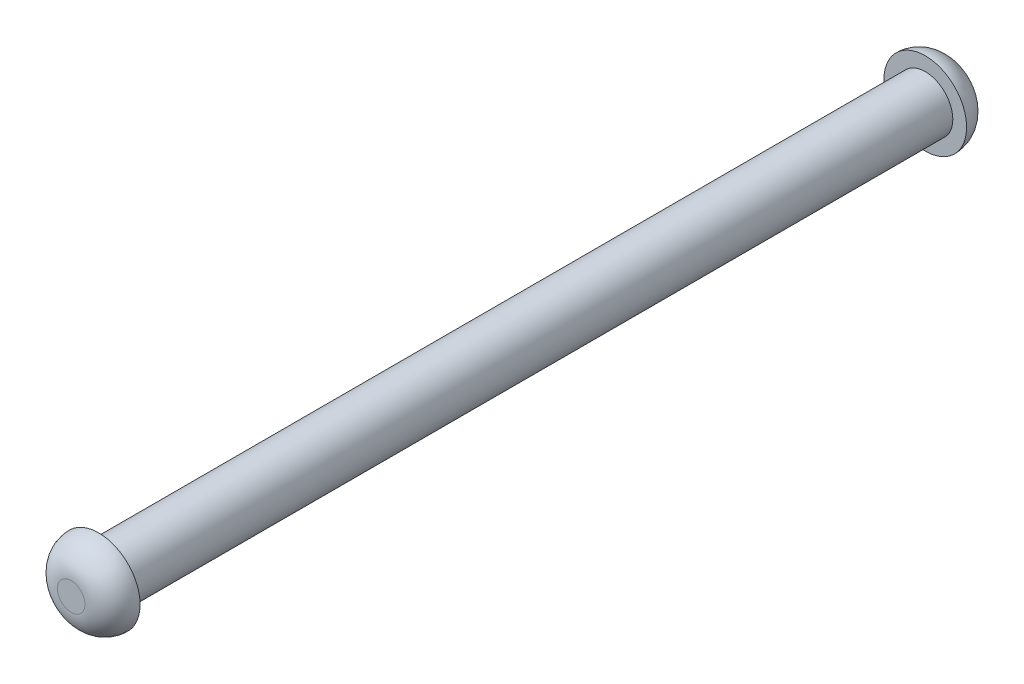
ISO-10303-21;
HEADER;
FILE_DESCRIPTION(('STEP AP214'),'2;1');
FILE_NAME('part.step','',(''),(''),'','','');
FILE_SCHEMA(('AUTOMOTIVE_DESIGN { 1 0 10303 214 1 1 1 1 }'));
ENDSEC;
DATA;
#1=APPLICATION_CONTEXT('core data for automotive mechanical design processes');
#2=APPLICATION_PROTOCOL_DEFINITION('international standard','automotive_design',2000,#1);
#3=PRODUCT_CONTEXT('',#1,'mechanical');
#4=PRODUCT('Part','Part','',(#3));
#5=PRODUCT_RELATED_PRODUCT_CATEGORY('part','',(#4));
#6=PRODUCT_DEFINITION_FORMATION('','',#4);
#7=PRODUCT_DEFINITION_CONTEXT('part definition',#1,'design');
#8=PRODUCT_DEFINITION('design','',#6,#7);
#9=PRODUCT_DEFINITION_SHAPE('','',#8);
#10=(LENGTH_UNIT() NAMED_UNIT(*) SI_UNIT(.MILLI.,.METRE.));
#11=(NAMED_UNIT(*) PLANE_ANGLE_UNIT() SI_UNIT($,.RADIAN.));
#12=(NAMED_UNIT(*) SI_UNIT($,.STERADIAN.) SOLID_ANGLE_UNIT());
#13=UNCERTAINTY_MEASURE_WITH_UNIT(LENGTH_MEASURE(1.E-05),#10,'distance_accuracy_value','');
#14=(GEOMETRIC_REPRESENTATION_CONTEXT(3) GLOBAL_UNCERTAINTY_ASSIGNED_CONTEXT((#13)) GLOBAL_UNIT_ASSIGNED_CONTEXT((#10,
#11,#12)) REPRESENTATION_CONTEXT('',''));
#15=CARTESIAN_POINT('',(0.,0.,0.));
#16=DIRECTION('',(0.,0.,1.));
#17=DIRECTION('',(1.,0.,0.));
#18=AXIS2_PLACEMENT_3D('',#15,#16,#17);
#19=CARTESIAN_POINT('',(0.,0.,150.));
#20=DIRECTION('',(0.,0.,-1.));
#21=DIRECTION('',(-1.,0.,0.));
#22=AXIS2_PLACEMENT_3D('',#19,#20,#21);
#23=CYLINDRICAL_SURFACE('',#22,5.);
#24=CARTESIAN_POINT('',(0.,0.,150.));
#25=DIRECTION('',(0.,0.,1.));
#26=DIRECTION('',(1.,0.,0.));
#27=AXIS2_PLACEMENT_3D('',#24,#25,#26);
#28=CIRCLE('',#27,5.);
#29=CARTESIAN_POINT('',(5.,0.,150.));
#30=VERTEX_POINT('',#29);
#31=EDGE_CURVE('E41',#30,#30,#28,.T.);
#32=ORIENTED_EDGE('',*,*,#31,.F.);
#33=EDGE_LOOP('',(#32));
#34=FACE_BOUND('',#33,.T.);
#35=CARTESIAN_POINT('',(0.,0.,0.));
#36=DIRECTION('',(0.,0.,1.));
#37=DIRECTION('',(1.,0.,0.));
#38=AXIS2_PLACEMENT_3D('',#35,#36,#37);
#39=CIRCLE('',#38,5.);
#40=CARTESIAN_POINT('',(5.,0.,0.));
#41=VERTEX_POINT('',#40);
#42=EDGE_CURVE('E48',#41,#41,#39,.T.);
#43=ORIENTED_EDGE('',*,*,#42,.T.);
#44=EDGE_LOOP('',(#43));
#45=FACE_BOUND('',#44,.T.);
#46=ADVANCED_FACE('F30',(#34,#45),#23,.T.);
#47=CARTESIAN_POINT('',(0.,0.,155.));
#48=DIRECTION('',(0.,0.,1.));
#49=DIRECTION('',(1.,0.,0.));
#50=AXIS2_PLACEMENT_3D('',#47,#48,#49);
#51=PLANE('',#50);
#52=CARTESIAN_POINT('',(0.,0.,155.));
#53=DIRECTION('',(0.,0.,1.));
#54=DIRECTION('',(1.,0.,0.));
#55=AXIS2_PLACEMENT_3D('',#52,#53,#54);
#56=CIRCLE('',#55,2.5);
#57=CARTESIAN_POINT('',(2.5,0.,155.));
#58=VERTEX_POINT('',#57);
#59=EDGE_CURVE('E37',#58,#58,#56,.T.);
#60=ORIENTED_EDGE('',*,*,#59,.T.);
#61=EDGE_LOOP('',(#60));
#62=FACE_BOUND('',#61,.T.);
#63=ADVANCED_FACE('F73',(#62),#51,.T.);
#64=CARTESIAN_POINT('',(0.,0.,150.));
#65=DIRECTION('',(0.,0.,1.));
#66=DIRECTION('',(1.,0.,0.));
#67=AXIS2_PLACEMENT_3D('',#64,#65,#66);
#68=PLANE('',#67);
#69=ORIENTED_EDGE('',*,*,#31,.T.);
#70=EDGE_LOOP('',(#69));
#71=FACE_BOUND('',#70,.T.);
#72=CARTESIAN_POINT('',(0.,0.,150.));
#73=DIRECTION('',(0.,0.,1.));
#74=DIRECTION('',(1.,0.,0.));
#75=AXIS2_PLACEMENT_3D('',#72,#73,#74);
#76=CIRCLE('',#75,7.5);
#77=CARTESIAN_POINT('',(7.5,0.,150.));
#78=VERTEX_POINT('',#77);
#79=EDGE_CURVE('E45',#78,#78,#76,.T.);
#80=ORIENTED_EDGE('',*,*,#79,.F.);
#81=EDGE_LOOP('',(#80));
#82=FACE_BOUND('',#81,.T.);
#83=ADVANCED_FACE('F79',(#71,#82),#68,.F.);
#84=CARTESIAN_POINT('',(0.,0.,150.));
#85=DIRECTION('',(0.,0.,1.));
#86=DIRECTION('',(1.,0.,0.));
#87=AXIS2_PLACEMENT_3D('',#84,#85,#86);
#88=DEGENERATE_TOROIDAL_SURFACE('',#87,2.5,5.,.T.);
#89=ORIENTED_EDGE('',*,*,#79,.T.);
#90=EDGE_LOOP('',(#89));
#91=FACE_BOUND('',#90,.T.);
#92=ORIENTED_EDGE('',*,*,#59,.F.);
#93=EDGE_LOOP('',(#92));
#94=FACE_BOUND('',#93,.T.);
#95=ADVANCED_FACE('F68',(#91,#94),#88,.T.);
#96=CARTESIAN_POINT('',(0.,0.,-5.));
#97=DIRECTION('',(0.,0.,-1.));
#98=DIRECTION('',(-1.,0.,0.));
#99=AXIS2_PLACEMENT_3D('',#96,#97,#98);
#100=PLANE('',#99);
#101=CARTESIAN_POINT('',(0.,0.,-5.));
#102=DIRECTION('',(0.,0.,-1.));
#103=DIRECTION('',(-1.,0.,0.));
#104=AXIS2_PLACEMENT_3D('',#101,#102,#103);
#105=CIRCLE('',#104,2.5);
#106=CARTESIAN_POINT('',(-2.5,0.,-5.));
#107=VERTEX_POINT('',#106);
#108=EDGE_CURVE('E10',#107,#107,#105,.T.);
#109=ORIENTED_EDGE('',*,*,#108,.T.);
#110=EDGE_LOOP('',(#109));
#111=FACE_BOUND('',#110,.T.);
#112=ADVANCED_FACE('F61',(#111),#100,.T.);
#113=CARTESIAN_POINT('',(0.,0.,0.));
#114=DIRECTION('',(0.,0.,-1.));
#115=DIRECTION('',(-1.,0.,0.));
#116=AXIS2_PLACEMENT_3D('',#113,#114,#115);
#117=PLANE('',#116);
#118=ORIENTED_EDGE('',*,*,#42,.F.);
#119=EDGE_LOOP('',(#118));
#120=FACE_BOUND('',#119,.T.);
#121=CARTESIAN_POINT('',(0.,0.,0.));
#122=DIRECTION('',(0.,0.,-1.));
#123=DIRECTION('',(-1.,0.,0.));
#124=AXIS2_PLACEMENT_3D('',#121,#122,#123);
#125=CIRCLE('',#124,7.5);
#126=CARTESIAN_POINT('',(-7.5,0.,0.));
#127=VERTEX_POINT('',#126);
#128=EDGE_CURVE('E50',#127,#127,#125,.T.);
#129=ORIENTED_EDGE('',*,*,#128,.F.);
#130=EDGE_LOOP('',(#129));
#131=FACE_BOUND('',#130,.T.);
#132=ADVANCED_FACE('F59',(#120,#131),#117,.F.);
#133=CARTESIAN_POINT('',(0.,0.,0.));
#134=DIRECTION('',(0.,0.,-1.));
#135=DIRECTION('',(-1.,0.,0.));
#136=AXIS2_PLACEMENT_3D('',#133,#134,#135);
#137=DEGENERATE_TOROIDAL_SURFACE('',#136,2.5,5.,.T.);
#138=ORIENTED_EDGE('',*,*,#128,.T.);
#139=EDGE_LOOP('',(#138));
#140=FACE_BOUND('',#139,.T.);
#141=ORIENTED_EDGE('',*,*,#108,.F.);
#142=EDGE_LOOP('',(#141));
#143=FACE_BOUND('',#142,.T.);
#144=ADVANCED_FACE('F32',(#140,#143),#137,.T.);
#145=CLOSED_SHELL('',(#46,#63,#83,#95,#112,#132,#144));
#146=MANIFOLD_SOLID_BREP('B2',#145);
#147=ADVANCED_BREP_SHAPE_REPRESENTATION('',(#18,#146),#14);
#148=SHAPE_DEFINITION_REPRESENTATION(#9,#147);
ENDSEC;
END-ISO-10303-21;
